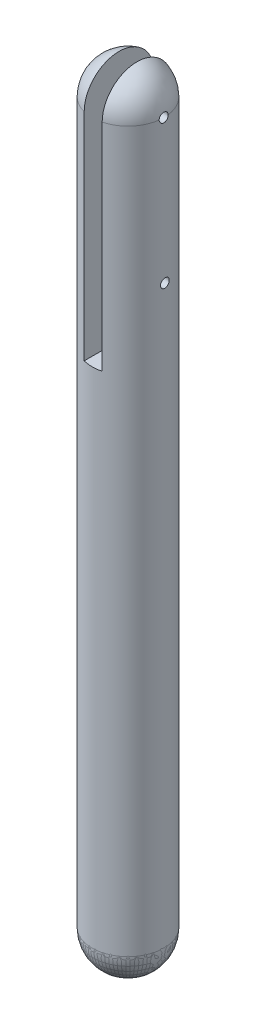
ISO-10303-21;
HEADER;
FILE_DESCRIPTION(('STEP AP214'),'2;1');
FILE_NAME('part.step','',(''),(''),'','','');
FILE_SCHEMA(('AUTOMOTIVE_DESIGN { 1 0 10303 214 1 1 1 1 }'));
ENDSEC;
DATA;
#1=APPLICATION_CONTEXT('core data for automotive mechanical design processes');
#2=APPLICATION_PROTOCOL_DEFINITION('international standard','automotive_design',2000,#1);
#3=PRODUCT_CONTEXT('',#1,'mechanical');
#4=PRODUCT('Part','Part','',(#3));
#5=PRODUCT_RELATED_PRODUCT_CATEGORY('part','',(#4));
#6=PRODUCT_DEFINITION_FORMATION('','',#4);
#7=PRODUCT_DEFINITION_CONTEXT('part definition',#1,'design');
#8=PRODUCT_DEFINITION('design','',#6,#7);
#9=PRODUCT_DEFINITION_SHAPE('','',#8);
#10=(LENGTH_UNIT() NAMED_UNIT(*) SI_UNIT(.MILLI.,.METRE.));
#11=(NAMED_UNIT(*) PLANE_ANGLE_UNIT() SI_UNIT($,.RADIAN.));
#12=(NAMED_UNIT(*) SI_UNIT($,.STERADIAN.) SOLID_ANGLE_UNIT());
#13=UNCERTAINTY_MEASURE_WITH_UNIT(LENGTH_MEASURE(1.E-05),#10,'distance_accuracy_value','');
#14=(GEOMETRIC_REPRESENTATION_CONTEXT(3) GLOBAL_UNCERTAINTY_ASSIGNED_CONTEXT((#13)) GLOBAL_UNIT_ASSIGNED_CONTEXT((#10,
#11,#12)) REPRESENTATION_CONTEXT('',''));
#15=CARTESIAN_POINT('',(0.,0.,0.));
#16=DIRECTION('',(0.,0.,1.));
#17=DIRECTION('',(1.,0.,0.));
#18=AXIS2_PLACEMENT_3D('',#15,#16,#17);
#19=CARTESIAN_POINT('',(0.,-100.,0.));
#20=DIRECTION('',(0.,1.,0.));
#21=DIRECTION('',(1.,0.,0.));
#22=AXIS2_PLACEMENT_3D('',#19,#20,#21);
#23=SPHERICAL_SURFACE('',#22,9.99999999999999);
#24=CARTESIAN_POINT('',(0.,-90.,0.));
#25=VERTEX_POINT('',#24);
#26=VERTEX_LOOP('',#25);
#27=FACE_BOUND('',#26,.T.);
#28=ADVANCED_FACE('F42',(#27),#23,.T.);
#29=CLOSED_SHELL('',(#28));
#30=MANIFOLD_SOLID_BREP('B2',#29);
#31=CARTESIAN_POINT('',(0.,100.,0.));
#32=DIRECTION('',(0.,-1.,0.));
#33=DIRECTION('',(1.,0.,0.));
#34=AXIS2_PLACEMENT_3D('',#31,#32,#33);
#35=SPHERICAL_SURFACE('',#34,10.);
#36=CARTESIAN_POINT('',(9.92156741649222,100.,0.));
#37=DIRECTION('',(-1.,0.,0.));
#38=DIRECTION('',(0.,0.,1.));
#39=AXIS2_PLACEMENT_3D('',#36,#37,#38);
#40=CIRCLE('',#39,1.25);
#41=CARTESIAN_POINT('',(9.92156741649231,100.,-1.25));
#42=VERTEX_POINT('',#41);
#43=CARTESIAN_POINT('',(9.9215674164922,100.,1.25));
#44=VERTEX_POINT('',#43);
#45=EDGE_CURVE('E145',#42,#44,#40,.F.);
#46=ORIENTED_EDGE('',*,*,#45,.F.);
#47=CARTESIAN_POINT('',(0.,100.,0.));
#48=DIRECTION('',(0.,-1.,0.));
#49=DIRECTION('',(1.,0.,0.));
#50=AXIS2_PLACEMENT_3D('',#47,#48,#49);
#51=CIRCLE('',#50,10.);
#52=CARTESIAN_POINT('',(2.5,100.,-9.68245836551853));
#53=VERTEX_POINT('',#52);
#54=EDGE_CURVE('E125',#53,#42,#51,.T.);
#55=ORIENTED_EDGE('',*,*,#54,.F.);
#56=CARTESIAN_POINT('',(2.5,100.,0.));
#57=DIRECTION('',(1.,0.,0.));
#58=DIRECTION('',(0.,1.,0.));
#59=AXIS2_PLACEMENT_3D('',#56,#57,#58);
#60=CIRCLE('',#59,9.68245836551854);
#61=CARTESIAN_POINT('',(2.5,100.,9.68245836551854));
#62=VERTEX_POINT('',#61);
#63=EDGE_CURVE('E132',#62,#53,#60,.F.);
#64=ORIENTED_EDGE('',*,*,#63,.F.);
#65=EDGE_CURVE('E126',#44,#62,#51,.T.);
#66=ORIENTED_EDGE('',*,*,#65,.F.);
#67=EDGE_LOOP('',(#46,#55,#64,#66));
#68=FACE_BOUND('',#67,.T.);
#69=ADVANCED_FACE('F54',(#68),#35,.T.);
#70=CARTESIAN_POINT('',(-9.92156741649221,100.,0.));
#71=DIRECTION('',(1.,0.,0.));
#72=DIRECTION('',(0.,0.,-1.));
#73=AXIS2_PLACEMENT_3D('',#70,#71,#72);
#74=CIRCLE('',#73,1.25);
#75=CARTESIAN_POINT('',(-9.9215674164922,100.,1.25));
#76=VERTEX_POINT('',#75);
#77=CARTESIAN_POINT('',(-9.92156741649221,100.,-1.25));
#78=VERTEX_POINT('',#77);
#79=EDGE_CURVE('E111',#76,#78,#74,.F.);
#80=ORIENTED_EDGE('',*,*,#79,.F.);
#81=CARTESIAN_POINT('',(-2.5,100.,9.68245836551854));
#82=VERTEX_POINT('',#81);
#83=EDGE_CURVE('E117',#82,#76,#51,.T.);
#84=ORIENTED_EDGE('',*,*,#83,.F.);
#85=CARTESIAN_POINT('',(-2.5,100.,0.));
#86=DIRECTION('',(-1.,0.,0.));
#87=DIRECTION('',(0.,-1.,0.));
#88=AXIS2_PLACEMENT_3D('',#85,#86,#87);
#89=CIRCLE('',#88,9.68245836551854);
#90=CARTESIAN_POINT('',(-2.5,100.,-9.68245836551854));
#91=VERTEX_POINT('',#90);
#92=EDGE_CURVE('E78',#91,#82,#89,.F.);
#93=ORIENTED_EDGE('',*,*,#92,.F.);
#94=EDGE_CURVE('E118',#78,#91,#51,.T.);
#95=ORIENTED_EDGE('',*,*,#94,.F.);
#96=EDGE_LOOP('',(#80,#84,#93,#95));
#97=FACE_BOUND('',#96,.T.);
#98=ADVANCED_FACE('F56',(#97),#35,.T.);
#99=CARTESIAN_POINT('',(0.,-100.,0.));
#100=DIRECTION('',(0.,-1.,0.));
#101=DIRECTION('',(-1.,0.,0.));
#102=AXIS2_PLACEMENT_3D('',#99,#100,#101);
#103=SPHERICAL_SURFACE('',#102,10.);
#104=CARTESIAN_POINT('',(0.,-100.,0.));
#105=DIRECTION('',(0.,-1.,0.));
#106=DIRECTION('',(1.,0.,0.));
#107=AXIS2_PLACEMENT_3D('',#104,#105,#106);
#108=CIRCLE('',#107,9.99999999999997);
#109=CARTESIAN_POINT('',(10.,-100.,0.));
#110=VERTEX_POINT('',#109);
#111=EDGE_CURVE('E123',#110,#110,#108,.T.);
#112=ORIENTED_EDGE('',*,*,#111,.T.);
#113=EDGE_LOOP('',(#112));
#114=FACE_BOUND('',#113,.T.);
#115=ADVANCED_FACE('F205',(#114),#103,.T.);
#116=CARTESIAN_POINT('',(0.,100.,0.));
#117=DIRECTION('',(0.,-1.,0.));
#118=DIRECTION('',(1.,0.,0.));
#119=AXIS2_PLACEMENT_3D('',#116,#117,#118);
#120=CYLINDRICAL_SURFACE('',#119,9.99999999999999);
#121=CARTESIAN_POINT('',(10.,61.2102547669151,0.));
#122=CARTESIAN_POINT('',(9.99999922075273,61.1924558536573,0.0677551433919592));
#123=CARTESIAN_POINT('',(9.99930470937657,61.1689364383772,0.134053462173073));
#124=CARTESIAN_POINT('',(9.99677732255985,61.1111182809687,0.261804354690536));
#125=CARTESIAN_POINT('',(9.9949432174497,61.0768079147245,0.323251613099448));
#126=CARTESIAN_POINT('',(9.99050752407033,60.9984201409211,0.439479437835096));
#127=CARTESIAN_POINT('',(9.987906432803,60.9543490628263,0.494264288987005));
#128=CARTESIAN_POINT('',(9.98237276596149,60.8576819870995,0.595666314860065));
#129=CARTESIAN_POINT('',(9.97944025547366,60.8050876624429,0.642285088720733));
#130=CARTESIAN_POINT('',(9.97368437247386,60.692631163987,0.726224189307111));
#131=CARTESIAN_POINT('',(9.97086143750259,60.6327431569669,0.763509946857733));
#132=CARTESIAN_POINT('',(9.96575502933599,60.5075357179316,0.827503523454673));
#133=CARTESIAN_POINT('',(9.96347156830909,60.4422161634466,0.854211103907363));
#134=CARTESIAN_POINT('',(9.95977686713034,60.3080341992004,0.896266481148849));
#135=CARTESIAN_POINT('',(9.95836511841395,60.2391738806042,0.911620902503819));
#136=CARTESIAN_POINT('',(9.95661462297802,60.0998399751531,0.93054681738624));
#137=CARTESIAN_POINT('',(9.9562758466591,60.0293664328551,0.934118635952604));
#138=CARTESIAN_POINT('',(9.95671878503276,59.8891015188251,0.929384732355681));
#139=CARTESIAN_POINT('',(9.95749610303527,59.8193085548041,0.921125616723659));
#140=CARTESIAN_POINT('',(9.96005268677378,59.6821056287523,0.893054697898082));
#141=CARTESIAN_POINT('',(9.96183195702334,59.6146956774577,0.873242842662259));
#142=CARTESIAN_POINT('',(9.96613900380381,59.4841332175519,0.822626663283878));
#143=CARTESIAN_POINT('',(9.96866708274455,59.4209824417027,0.791817896955211));
#144=CARTESIAN_POINT('',(9.97410498540843,59.30073322118,0.720082312091906));
#145=CARTESIAN_POINT('',(9.97701482085045,59.2436349623996,0.679155182916886));
#146=CARTESIAN_POINT('',(9.98279346229595,59.1368711059594,0.588146394071747));
#147=CARTESIAN_POINT('',(9.9856620587041,59.0872360199614,0.538028919452478));
#148=CARTESIAN_POINT('',(9.99088967690328,58.9970738900058,0.430155338495266));
#149=CARTESIAN_POINT('',(9.99324870026724,58.9565468179339,0.372399255736791));
#150=CARTESIAN_POINT('',(9.99703655860595,58.8857687413296,0.250894633552639));
#151=CARTESIAN_POINT('',(9.99846567814853,58.8555145944479,0.187147934207277));
#152=CARTESIAN_POINT('',(10.0000627426896,58.8061411454981,0.0554649310324432));
#153=CARTESIAN_POINT('',(10.0002307405236,58.7870213769787,-0.0124711971578524));
#154=CARTESIAN_POINT('',(9.99910773668996,58.7605405665586,-0.150196066167287));
#155=CARTESIAN_POINT('',(9.99782478542431,58.7531151844628,-0.219972507230552));
#156=CARTESIAN_POINT('',(9.99377175439099,58.7500189090679,-0.359741033460417));
#157=CARTESIAN_POINT('',(9.99100169620658,58.754347845175,-0.429733115482634));
#158=CARTESIAN_POINT('',(9.98410483226082,58.7745899642022,-0.56782349131972));
#159=CARTESIAN_POINT('',(9.97998042742901,58.7904827074674,-0.635924906786446));
#160=CARTESIAN_POINT('',(9.97065068566941,58.8333487279624,-0.768467556171692));
#161=CARTESIAN_POINT('',(9.96544530103787,58.8603224942502,-0.832908628398988));
#162=CARTESIAN_POINT('',(9.95431883193546,58.9247946745676,-0.956783278349281));
#163=CARTESIAN_POINT('',(9.94839313541342,58.9623631882799,-1.01617995313072));
#164=CARTESIAN_POINT('',(9.93635383155002,59.0468943973692,-1.12784384855809));
#165=CARTESIAN_POINT('',(9.93024021450393,59.0938575786043,-1.18011070024022));
#166=CARTESIAN_POINT('',(9.91832464994712,59.1962435166766,-1.27640573764652));
#167=CARTESIAN_POINT('',(9.91252515102247,59.2517225466252,-1.32037442987823));
#168=CARTESIAN_POINT('',(9.90182453334159,59.3693588128581,-1.39836546022831));
#169=CARTESIAN_POINT('',(9.89692339515101,59.4315159046288,-1.43238801352219));
#170=CARTESIAN_POINT('',(9.88850781109233,59.5605170704513,-1.48937719945058));
#171=CARTESIAN_POINT('',(9.88498822522109,59.6273426605278,-1.51238488398757));
#172=CARTESIAN_POINT('',(9.87965652739746,59.7639757780963,-1.54683361304348));
#173=CARTESIAN_POINT('',(9.87784428262701,59.8337830731929,-1.55827555729346));
#174=CARTESIAN_POINT('',(9.87611811233728,59.9735768325705,-1.56917862988323));
#175=CARTESIAN_POINT('',(9.87618356076308,60.0435529126623,-1.56876993441279));
#176=CARTESIAN_POINT('',(9.8781551998152,60.1824317883645,-1.55630608763255));
#177=CARTESIAN_POINT('',(9.88006134856942,60.2513346083531,-1.54425120124932));
#178=CARTESIAN_POINT('',(9.88551735138862,60.3858639031359,-1.50892725489708));
#179=CARTESIAN_POINT('',(9.88906124584775,60.4515013092451,-1.48569884193559));
#180=CARTESIAN_POINT('',(9.89745217365548,60.577952173617,-1.42872849537736));
#181=CARTESIAN_POINT('',(9.90229927590058,60.6387653766189,-1.39498600591939));
#182=CARTESIAN_POINT('',(9.91289245286158,60.7544177076356,-1.31760994177696));
#183=CARTESIAN_POINT('',(9.91864595709096,60.8092004711122,-1.27389315035587));
#184=CARTESIAN_POINT('',(9.93049571971525,60.9106887200176,-1.17795812933603));
#185=CARTESIAN_POINT('',(9.93659198757999,60.9573939821368,-1.12573966477849));
#186=CARTESIAN_POINT('',(9.94864687977604,61.0418393522429,-1.01371712443555));
#187=CARTESIAN_POINT('',(9.95460372678661,61.0794932239153,-0.95384781315584));
#188=CARTESIAN_POINT('',(9.9658138649689,61.1442110600969,-0.828555891961568));
#189=CARTESIAN_POINT('',(9.97106701335507,61.1712728775361,-0.763132159401287));
#190=CARTESIAN_POINT('',(9.98044627661644,61.2139721014867,-0.628671507919739));
#191=CARTESIAN_POINT('',(9.98457375176482,61.2296233352757,-0.559639071139293));
#192=CARTESIAN_POINT('',(9.99142411120762,61.2490529654595,-0.419906440105568));
#193=CARTESIAN_POINT('',(9.99414854761239,61.2528445053011,-0.349208179638563));
#194=CARTESIAN_POINT('',(9.99742666756125,61.2491986173023,-0.231703018357655));
#195=CARTESIAN_POINT('',(9.99840109004013,61.2450797089174,-0.184779190224219));
#196=CARTESIAN_POINT('',(9.99968801494348,61.2315858423277,-0.09168445890261));
#197=CARTESIAN_POINT('',(10.0000005234482,61.2222109324049,-0.045513548802091));
#198=CARTESIAN_POINT('',(10.,61.2102547669151,0.));
#199=B_SPLINE_CURVE_WITH_KNOTS('',3,(#121,#122,#123,#124,#125,#126,#127,#128,#129,#130,#131,
#132,#133,#134,#135,#136,#137,#138,#139,#140,#141,#142,#143,#144,#145,#146,#147,#148,#149,#150,
#151,#152,#153,#154,#155,#156,#157,#158,#159,#160,#161,#162,#163,#164,#165,#166,#167,#168,#169,
#170,#171,#172,#173,#174,#175,#176,#177,#178,#179,#180,#181,#182,#183,#184,#185,#186,#187,#188,
#189,#190,#191,#192,#193,#194,#195,#196,#197,#198),.UNSPECIFIED.,.T.,.F.,(4,2,2,2,2,2,2,2,2,2,2,
2,2,2,2,2,2,2,2,2,2,2,2,2,2,2,2,2,2,2,2,2,2,2,2,2,2,2,4),(0.,0.209989823831639,
0.420206629970538,0.630287515263106,0.840327214913993,1.05113375045477,1.26194504052291,
1.4726332249614,1.68331559723492,1.89317029070897,2.10302592953439,2.31296643535097,
2.52291338727946,2.73369659915287,2.94447916037895,3.15519718785395,3.36590638710589,
3.57545220497165,3.78499498165666,3.99416827711394,4.20335080537355,4.41395123107877,
4.62456255109085,4.83663080916037,5.04869447898988,5.25996152302954,5.47121213075379,
5.68014309376542,5.88906930414514,6.09724116629566,6.30542403600417,6.51541179333146,
6.72540535502741,6.93732666264459,7.14929090570485,7.36099786287222,7.57247011358041,
7.71352907103438,7.8545867327327),.UNSPECIFIED.);
#200=CARTESIAN_POINT('',(10.,61.2102547669151,0.));
#201=VERTEX_POINT('',#200);
#202=EDGE_CURVE('E174',#201,#201,#199,.T.);
#203=ORIENTED_EDGE('',*,*,#202,.F.);
#204=EDGE_LOOP('',(#203));
#205=FACE_BOUND('',#204,.T.);
#206=CARTESIAN_POINT('',(-9.99495709397346,58.7512604284789,-0.317541634481472));
#207=CARTESIAN_POINT('',(-9.99717287889749,58.7512633487862,-0.247767395474852));
#208=CARTESIAN_POINT('',(-9.99865362302269,58.7571220615867,-0.177927189512773));
#209=CARTESIAN_POINT('',(-10.0001574899652,58.7804243288944,-0.0401418186757699));
#210=CARTESIAN_POINT('',(-10.0001791558703,58.797879445033,0.0278013843683372));
#211=CARTESIAN_POINT('',(-9.99894118973362,58.8438727033208,0.15977633872146));
#212=CARTESIAN_POINT('',(-9.99768226472156,58.8724047244025,0.223810227729985));
#213=CARTESIAN_POINT('',(-9.99419369002461,58.9397318794147,0.346186095450651));
#214=CARTESIAN_POINT('',(-9.99196420427216,58.9785252797142,0.404529033356001));
#215=CARTESIAN_POINT('',(-9.98692800158285,59.065424635624,0.51409291976997));
#216=CARTESIAN_POINT('',(-9.98411942521477,59.1135605596456,0.565290012525996));
#217=CARTESIAN_POINT('',(-9.97837869574651,59.2177149643716,0.658911268321315));
#218=CARTESIAN_POINT('',(-9.97544653615009,59.273733859813,0.701334969487003));
#219=CARTESIAN_POINT('',(-9.96988747006123,59.3923478828821,0.776383357323358));
#220=CARTESIAN_POINT('',(-9.9672619403448,59.4549704363211,0.808964817163741));
#221=CARTESIAN_POINT('',(-9.96271644875294,59.5848219940823,0.863148042665063));
#222=CARTESIAN_POINT('',(-9.96079647482045,59.6520509196641,0.88474999595434));
#223=CARTESIAN_POINT('',(-9.95794237535219,59.7890685471896,0.916317079143828));
#224=CARTESIAN_POINT('',(-9.95700631144884,59.8588519347881,0.926305093411254));
#225=CARTESIAN_POINT('',(-9.95624730936342,59.9991102813461,0.934428698103834));
#226=CARTESIAN_POINT('',(-9.95642434391306,60.0695852233219,0.93256457887833));
#227=CARTESIAN_POINT('',(-9.95786359221615,60.2089673061129,0.917066738184375));
#228=CARTESIAN_POINT('',(-9.95912202489442,60.2778790518826,0.903474024702912));
#229=CARTESIAN_POINT('',(-9.96253987441317,60.4124398764064,0.864967994963325));
#230=CARTESIAN_POINT('',(-9.96469930593008,60.4780889019943,0.840054494299505));
#231=CARTESIAN_POINT('',(-9.96961355122974,60.6043905013737,0.779566109297345));
#232=CARTESIAN_POINT('',(-9.97236938389035,60.6650342763148,0.743972939339697));
#233=CARTESIAN_POINT('',(-9.97806973990332,60.7795050641537,0.663144245430128));
#234=CARTESIAN_POINT('',(-9.98101426831679,60.8333318940959,0.617908462773772));
#235=CARTESIAN_POINT('',(-9.98665264655754,60.9328460394902,0.518875582912959));
#236=CARTESIAN_POINT('',(-9.98934553607501,60.9785027372537,0.465047655018655));
#237=CARTESIAN_POINT('',(-9.99402103489487,61.0601350546612,0.350464756139953));
#238=CARTESIAN_POINT('',(-9.99600365456773,61.0961108156522,0.289709886311047));
#239=CARTESIAN_POINT('',(-9.99886943673621,61.1572891016005,0.163114687402185));
#240=CARTESIAN_POINT('',(-9.99975466689505,61.1825118280125,0.0972841711474343));
#241=CARTESIAN_POINT('',(-10.0001565138171,61.221551888979,-0.0376790988695813));
#242=CARTESIAN_POINT('',(-9.99967318846615,61.2353697058949,-0.106811712841489));
#243=CARTESIAN_POINT('',(-9.99721471210096,61.2511643550903,-0.245997658539455));
#244=CARTESIAN_POINT('',(-9.99524790637855,61.2532068755335,-0.316043693500364));
#245=CARTESIAN_POINT('',(-9.9898669180148,61.2455902507894,-0.455438941324031));
#246=CARTESIAN_POINT('',(-9.9864527363144,61.2359311132092,-0.52478815463976));
#247=CARTESIAN_POINT('',(-9.97837272223098,61.2052135900858,-0.660852773880742));
#248=CARTESIAN_POINT('',(-9.97370659339222,61.1841525034058,-0.727567551684904));
#249=CARTESIAN_POINT('',(-9.96346281401032,61.1312508037894,-0.856501898133302));
#250=CARTESIAN_POINT('',(-9.9578851153873,61.0994096221721,-0.918721229419723));
#251=CARTESIAN_POINT('',(-9.94622114752026,61.025553654603,-1.03743678326597));
#252=CARTESIAN_POINT('',(-9.94013119225205,60.9834601065548,-1.09388364801717));
#253=CARTESIAN_POINT('',(-9.92800917661058,60.8904044384073,-1.19893084204104));
#254=CARTESIAN_POINT('',(-9.92197711863616,60.8394419525025,-1.24753084750517));
#255=CARTESIAN_POINT('',(-9.91048716805416,60.7297667698372,-1.33575396564824));
#256=CARTESIAN_POINT('',(-9.90503236963665,60.671015769592,-1.37532989719711));
#257=CARTESIAN_POINT('',(-9.89524973562431,60.5476078451794,-1.44403679716896));
#258=CARTESIAN_POINT('',(-9.89092185165092,60.4829511747041,-1.4731682139963));
#259=CARTESIAN_POINT('',(-9.88383882456319,60.349994632242,-1.51996395336557));
#260=CARTESIAN_POINT('',(-9.88107383384211,60.2817206053207,-1.53770017476637));
#261=CARTESIAN_POINT('',(-9.87734815484016,60.1431170131683,-1.56145463395445));
#262=CARTESIAN_POINT('',(-9.87638733731256,60.0727875955472,-1.56747371113151));
#263=CARTESIAN_POINT('',(-9.87636600297864,59.9328641074518,-1.5676077059488));
#264=CARTESIAN_POINT('',(-9.8772854972404,59.8632701259443,-1.56184784134773));
#265=CARTESIAN_POINT('',(-9.88089398808741,59.7260536906387,-1.53885263347401));
#266=CARTESIAN_POINT('',(-9.88358297830333,59.658431229745,-1.52161733150735));
#267=CARTESIAN_POINT('',(-9.89046782184958,59.5270933844687,-1.47620103479308));
#268=CARTESIAN_POINT('',(-9.89466288201797,59.4633759641614,-1.44802580085392));
#269=CARTESIAN_POINT('',(-9.90416327368289,59.3415576485137,-1.38154711091149));
#270=CARTESIAN_POINT('',(-9.90946863794486,59.2834569189978,-1.34324335600345));
#271=CARTESIAN_POINT('',(-9.92076020261455,59.1738866280787,-1.25714588714202));
#272=CARTESIAN_POINT('',(-9.92675273563435,59.1224899325125,-1.2092602719695));
#273=CARTESIAN_POINT('',(-9.93883531666244,59.0284180549444,-1.10556398346566));
#274=CARTESIAN_POINT('',(-9.94492538954936,58.9857451375068,-1.04975125872956));
#275=CARTESIAN_POINT('',(-9.95671989664367,58.9100237659077,-0.931287627779475));
#276=CARTESIAN_POINT('',(-9.96242096922605,58.8770526173559,-0.868586989093764));
#277=CARTESIAN_POINT('',(-9.9729061097469,58.8221651036082,-0.738501773935106));
#278=CARTESIAN_POINT('',(-9.97769115456389,58.8002369207046,-0.671122292834242));
#279=CARTESIAN_POINT('',(-9.98465401341589,58.7732351855972,-0.555766471249513));
#280=CARTESIAN_POINT('',(-9.98717529877996,58.7650084808757,-0.50852466554338));
#281=CARTESIAN_POINT('',(-9.99156572070655,58.7540201216818,-0.41337949236445));
#282=CARTESIAN_POINT('',(-9.99343486263462,58.7512584222448,-0.365476130338039));
#283=CARTESIAN_POINT('',(-9.99495709397346,58.7512604284789,-0.317541634481472));
#284=B_SPLINE_CURVE_WITH_KNOTS('',3,(#206,#207,#208,#209,#210,#211,#212,#213,#214,#215,#216,
#217,#218,#219,#220,#221,#222,#223,#224,#225,#226,#227,#228,#229,#230,#231,#232,#233,#234,#235,
#236,#237,#238,#239,#240,#241,#242,#243,#244,#245,#246,#247,#248,#249,#250,#251,#252,#253,#254,
#255,#256,#257,#258,#259,#260,#261,#262,#263,#264,#265,#266,#267,#268,#269,#270,#271,#272,#273,
#274,#275,#276,#277,#278,#279,#280,#281,#282,#283),.UNSPECIFIED.,.T.,.F.,(4,2,2,2,2,2,2,2,2,2,2,
2,2,2,2,2,2,2,2,2,2,2,2,2,2,2,2,2,2,2,2,2,2,2,2,2,2,2,4),(0.,0.209253835233692,
0.418716610570876,0.628063801727444,0.837375646834032,1.04737035134186,1.25737610817002,
1.46829122503748,1.67920273746397,1.88969795705682,2.1001880200327,2.30994509174696,
2.51970558034244,2.72982728824575,2.93995463427461,3.15085365686321,3.36174960004637,
3.57224757347624,3.78273664361053,3.99205036151581,4.20136394334722,4.41072713355439,
4.62010136999004,4.8311378442685,5.04218302495455,5.25430754114165,5.4664229492986,
5.67718650307561,5.88793495767108,6.09645466882146,6.30497362940631,6.51338293554014,
6.72179839276803,6.9323178896562,7.14289196510622,7.35510112121707,7.56708269503099,
7.7108400440191,7.85459621020285),.UNSPECIFIED.);
#285=CARTESIAN_POINT('',(-9.99495709397346,58.7512604284789,-0.317541634481472));
#286=VERTEX_POINT('',#285);
#287=EDGE_CURVE('E179',#286,#286,#284,.T.);
#288=ORIENTED_EDGE('',*,*,#287,.F.);
#289=EDGE_LOOP('',(#288));
#290=FACE_BOUND('',#289,.T.);
#291=CARTESIAN_POINT('',(9.99999999999999,101.25,0.));
#292=CARTESIAN_POINT('',(9.99999902448213,101.249997029532,0.0699205477778808));
#293=CARTESIAN_POINT('',(9.9992589227745,101.244113560415,0.139884787151374));
#294=CARTESIAN_POINT('',(9.99637770055679,101.220736122715,0.277866401044876));
#295=CARTESIAN_POINT('',(9.99423511720714,101.203230031038,0.345881665311872));
#296=CARTESIAN_POINT('',(9.98879030522202,101.157131178043,0.477947787406526));
#297=CARTESIAN_POINT('',(9.9854888572777,101.128545879095,0.542001280073068));
#298=CARTESIAN_POINT('',(9.97809350439048,101.061116358015,0.664389737446517));
#299=CARTESIAN_POINT('',(9.97399973542057,101.022273895735,0.722725680778184));
#300=CARTESIAN_POINT('',(9.96545160653162,100.93520402508,0.832356408465657));
#301=CARTESIAN_POINT('',(9.96099557346207,100.886931435327,0.883615182468561));
#302=CARTESIAN_POINT('',(9.95223863004874,100.782468588232,0.977326396778747));
#303=CARTESIAN_POINT('',(9.94793772762133,100.726277927543,1.01977838819613));
#304=CARTESIAN_POINT('',(9.93996152809791,100.607340011217,1.09480508064197));
#305=CARTESIAN_POINT('',(9.93628838588954,100.544571319216,1.12734604797054));
#306=CARTESIAN_POINT('',(9.9300056422884,100.414406474026,1.18141153828756));
#307=CARTESIAN_POINT('',(9.92739600056567,100.347010496426,1.20293647903261));
#308=CARTESIAN_POINT('',(9.92355169801806,100.209877902207,1.23424949001238));
#309=CARTESIAN_POINT('',(9.92230991718371,100.140155371148,1.24409835736585));
#310=CARTESIAN_POINT('',(9.92132014071395,100.000036868264,1.25196777477861));
#311=CARTESIAN_POINT('',(9.92157208500753,99.9296409236344,1.24998880050121));
#312=CARTESIAN_POINT('',(9.92353477684875,99.7905975863756,1.23430861822395));
#313=CARTESIAN_POINT('',(9.92523718980163,99.7219425068999,1.22067438149235));
#314=CARTESIAN_POINT('',(9.92989599878813,99.5879024893905,1.18217519159102));
#315=CARTESIAN_POINT('',(9.93285242022861,99.522517617643,1.15731001087595));
#316=CARTESIAN_POINT('',(9.93969557932325,99.3966660004891,1.09698277995582));
#317=CARTESIAN_POINT('',(9.94358486605721,99.3362133498755,1.06149162685381));
#318=CARTESIAN_POINT('',(9.95185355715298,99.2220966527934,0.980940734728455));
#319=CARTESIAN_POINT('',(9.9562329839283,99.1684329170132,0.935880558040385));
#320=CARTESIAN_POINT('',(9.96502554945211,99.0690286446386,0.83709955537689));
#321=CARTESIAN_POINT('',(9.96943871193444,99.023345454117,0.783321003920008));
#322=CARTESIAN_POINT('',(9.97777316277925,98.9416455599847,0.668828584556961));
#323=CARTESIAN_POINT('',(9.98169445000752,98.905628878664,0.60811470065912));
#324=CARTESIAN_POINT('',(9.98860576109289,98.8442843397681,0.481430835681732));
#325=CARTESIAN_POINT('',(9.99159547200767,98.8189600730594,0.415459097668852));
#326=CARTESIAN_POINT('',(9.99630392890029,98.7797647532384,0.280153970215525));
#327=CARTESIAN_POINT('',(9.99802273437934,98.7658931639315,0.210820738315332));
#328=CARTESIAN_POINT('',(9.99998798205379,98.7500712878697,0.0712565819567482));
#329=CARTESIAN_POINT('',(10.0002441807132,98.748042003818,0.00103474509930298));
#330=CARTESIAN_POINT('',(9.99928169002714,98.755753867028,-0.138748018248749));
#331=CARTESIAN_POINT('',(9.99806303209105,98.7654947636258,-0.208308958782354));
#332=CARTESIAN_POINT('',(9.99429384378345,98.7964048543872,-0.344562253860761));
#333=CARTESIAN_POINT('',(9.99174770406933,98.8175363817013,-0.411263285212353));
#334=CARTESIAN_POINT('',(9.98560861550098,98.8705887259565,-0.540174827429202));
#335=CARTESIAN_POINT('',(9.98201563110311,98.9025099092457,-0.602385185732654));
#336=CARTESIAN_POINT('',(9.97415911455055,98.9764265687537,-0.720902260343713));
#337=CARTESIAN_POINT('',(9.96989222021253,99.0184731449028,-0.777176879971912));
#338=CARTESIAN_POINT('',(9.96117571162827,99.1113747487671,-0.881898494813161));
#339=CARTESIAN_POINT('',(9.95672609013448,99.1622301261255,-0.930345179168427));
#340=CARTESIAN_POINT('',(9.94811552731291,99.2716537083786,-1.018315979409));
#341=CARTESIAN_POINT('',(9.94395637360662,99.3302641731552,-1.05778773028397));
#342=CARTESIAN_POINT('',(9.93642705518573,99.4533291224273,-1.12632644472175));
#343=CARTESIAN_POINT('',(9.93305687465512,99.5177834897383,-1.15539361686418));
#344=CARTESIAN_POINT('',(9.92749925196497,99.6505376595738,-1.20221328943327));
#345=CARTESIAN_POINT('',(9.92530872592393,99.718826915024,-1.21999531372855));
#346=CARTESIAN_POINT('',(9.92234957953726,99.8574512418903,-1.24383499693393));
#347=CARTESIAN_POINT('',(9.92158089304387,99.9277862179795,-1.24989320126788));
#348=CARTESIAN_POINT('',(9.92155438491227,100.067984464602,-1.25010326804242));
#349=CARTESIAN_POINT('',(9.92228612375976,100.137847624166,-1.24433739884964));
#350=CARTESIAN_POINT('',(9.92515557268599,100.275603564673,-1.22123720242466));
#351=CARTESIAN_POINT('',(9.92729328291539,100.343496345404,-1.20390287395288));
#352=CARTESIAN_POINT('',(9.93273057887274,100.475373478383,-1.15818353684483));
#353=CARTESIAN_POINT('',(9.93602974796391,100.539359222511,-1.12980249048547));
#354=CARTESIAN_POINT('',(9.94341891622408,100.661673327024,-1.06280345107516));
#355=CARTESIAN_POINT('',(9.94750892530205,100.72000161651,-1.0241853297548));
#356=CARTESIAN_POINT('',(9.95605302376116,100.82976561267,-0.937503165632929));
#357=CARTESIAN_POINT('',(9.96050936042015,100.881152730477,-0.889377812887488));
#358=CARTESIAN_POINT('',(9.96926415796449,100.975153412584,-0.785175113484197));
#359=CARTESIAN_POINT('',(9.97356258137794,101.017764905387,-0.729095894570786));
#360=CARTESIAN_POINT('',(9.98153528293372,101.093142678553,-0.610332810427104));
#361=CARTESIAN_POINT('',(9.9852071253915,101.12587090295,-0.547624639798083));
#362=CARTESIAN_POINT('',(9.99148824538362,101.180285621458,-0.417591451150639));
#363=CARTESIAN_POINT('',(9.99409867684787,101.201984113177,-0.350271540435117));
#364=CARTESIAN_POINT('',(9.99733360163872,101.228529669086,-0.235502885983961));
#365=CARTESIAN_POINT('',(9.99832862947726,101.236569470991,-0.18877783175846));
#366=CARTESIAN_POINT('',(9.99966215664593,101.247305622847,-0.0947085316062171));
#367=CARTESIAN_POINT('',(10.0000006608173,101.2500020122,-0.0473642902480134));
#368=CARTESIAN_POINT('',(9.99999999999999,101.25,0.));
#369=B_SPLINE_CURVE_WITH_KNOTS('',3,(#291,#292,#293,#294,#295,#296,#297,#298,#299,#300,#301,
#302,#303,#304,#305,#306,#307,#308,#309,#310,#311,#312,#313,#314,#315,#316,#317,#318,#319,#320,
#321,#322,#323,#324,#325,#326,#327,#328,#329,#330,#331,#332,#333,#334,#335,#336,#337,#338,#339,
#340,#341,#342,#343,#344,#345,#346,#347,#348,#349,#350,#351,#352,#353,#354,#355,#356,#357,#358,
#359,#360,#361,#362,#363,#364,#365,#366,#367,#368),.UNSPECIFIED.,.T.,.F.,(4,2,2,2,2,2,2,2,2,2,2,
2,2,2,2,2,2,2,2,2,2,2,2,2,2,2,2,2,2,2,2,2,2,2,2,2,2,2,4),(0.,0.209588636388123,
0.419396230471714,0.629062754090884,0.838693327955367,1.04935406600921,1.26002553900005,
1.47140625159435,1.68277894748403,1.89304612643161,2.10330484942333,2.31236348220847,
2.52142635083122,2.73106713142767,2.94071750256819,3.15181739068208,3.36291776556558,
3.57408897865803,3.7852503045189,3.99500139695961,4.20474802250964,4.41380526946698,
4.62286961539474,4.83301201464211,5.04316275687544,5.25450985753786,5.46585272110769,
5.67664037140463,5.88741821505313,6.09673450601107,6.30605081939773,6.51529212353244,
6.7245360495613,6.93517618845914,7.14586599235007,7.35735701518427,7.56861749342017,
7.71059421593814,7.85256989150218),.UNSPECIFIED.);
#370=EDGE_CURVE('E119',#44,#42,#369,.T.);
#371=ORIENTED_EDGE('',*,*,#370,.F.);
#372=ORIENTED_EDGE('',*,*,#65,.T.);
#373=DIRECTION('',(0.,-1.,0.));
#374=VECTOR('',#373,1.);
#375=CARTESIAN_POINT('',(2.5,100.,9.68245836551853));
#376=LINE('',#375,#374);
#377=CARTESIAN_POINT('',(2.50000000000001,40.,9.68245836551853));
#378=VERTEX_POINT('',#377);
#379=EDGE_CURVE('E215',#378,#62,#376,.F.);
#380=ORIENTED_EDGE('',*,*,#379,.F.);
#381=CARTESIAN_POINT('',(0.,40.,0.));
#382=DIRECTION('',(0.,-1.,0.));
#383=DIRECTION('',(0.,0.,-1.));
#384=AXIS2_PLACEMENT_3D('',#381,#382,#383);
#385=CIRCLE('',#384,9.99999999999999);
#386=CARTESIAN_POINT('',(-2.50000000000001,40.,9.68245836551853));
#387=VERTEX_POINT('',#386);
#388=EDGE_CURVE('E128',#387,#378,#385,.F.);
#389=ORIENTED_EDGE('',*,*,#388,.F.);
#390=DIRECTION('',(0.,-1.,0.));
#391=VECTOR('',#390,1.);
#392=CARTESIAN_POINT('',(-2.5,100.,9.68245836551853));
#393=LINE('',#392,#391);
#394=EDGE_CURVE('E63',#82,#387,#393,.T.);
#395=ORIENTED_EDGE('',*,*,#394,.F.);
#396=ORIENTED_EDGE('',*,*,#83,.T.);
#397=CARTESIAN_POINT('',(-9.99999999999998,98.75,0.));
#398=CARTESIAN_POINT('',(-9.99999902448213,98.7500029704679,0.0699205477778808));
#399=CARTESIAN_POINT('',(-9.99925892277449,98.7558864395846,0.139884787151374));
#400=CARTESIAN_POINT('',(-9.99637770055678,98.7792638772854,0.277866401044876));
#401=CARTESIAN_POINT('',(-9.99423511720713,98.7967699689617,0.345881665311871));
#402=CARTESIAN_POINT('',(-9.98879030522201,98.842868821957,0.477947787406528));
#403=CARTESIAN_POINT('',(-9.98548885727769,98.8714541209049,0.542001280073073));
#404=CARTESIAN_POINT('',(-9.97809350439047,98.9388836419849,0.664389737446522));
#405=CARTESIAN_POINT('',(-9.97399973542056,98.9777261042654,0.722725680778186));
#406=CARTESIAN_POINT('',(-9.96545160653161,99.0647959749198,0.832356408465654));
#407=CARTESIAN_POINT('',(-9.96099557346207,99.1130685646731,0.883615182468558));
#408=CARTESIAN_POINT('',(-9.95223863004874,99.2175314117683,0.977326396778745));
#409=CARTESIAN_POINT('',(-9.94793772762132,99.2737220724566,1.01977838819613));
#410=CARTESIAN_POINT('',(-9.93996152809791,99.3926599887828,1.09480508064197));
#411=CARTESIAN_POINT('',(-9.93628838588954,99.455428680784,1.12734604797054));
#412=CARTESIAN_POINT('',(-9.93000564228839,99.5855935259737,1.18141153828756));
#413=CARTESIAN_POINT('',(-9.92739600056566,99.6529895035735,1.20293647903261));
#414=CARTESIAN_POINT('',(-9.92355169801805,99.7901220977934,1.23424949001238));
#415=CARTESIAN_POINT('',(-9.92230991718371,99.8598446288521,1.24409835736585));
#416=CARTESIAN_POINT('',(-9.92132014071394,99.9999631317359,1.25196777477861));
#417=CARTESIAN_POINT('',(-9.92157208500752,100.070359076366,1.24998880050121));
#418=CARTESIAN_POINT('',(-9.92353477684874,100.209402413624,1.23430861822395));
#419=CARTESIAN_POINT('',(-9.92523718980163,100.2780574931,1.22067438149235));
#420=CARTESIAN_POINT('',(-9.92989599878813,100.412097510609,1.18217519159102));
#421=CARTESIAN_POINT('',(-9.9328524202286,100.477482382357,1.15731001087595));
#422=CARTESIAN_POINT('',(-9.93969557932324,100.603333999511,1.09698277995583));
#423=CARTESIAN_POINT('',(-9.9435848660572,100.663786650124,1.06149162685382));
#424=CARTESIAN_POINT('',(-9.95185355715297,100.777903347207,0.98094073472846));
#425=CARTESIAN_POINT('',(-9.95623298392829,100.831567082987,0.93588055804039));
#426=CARTESIAN_POINT('',(-9.96502554945211,100.930971355361,0.837099555376889));
#427=CARTESIAN_POINT('',(-9.96943871193443,100.976654545883,0.783321003920003));
#428=CARTESIAN_POINT('',(-9.97777316277925,101.058354440015,0.668828584556954));
#429=CARTESIAN_POINT('',(-9.98169445000751,101.094371121336,0.608114700659117));
#430=CARTESIAN_POINT('',(-9.98860576109288,101.155715660232,0.481430835681733));
#431=CARTESIAN_POINT('',(-9.99159547200767,101.181039926941,0.415459097668854));
#432=CARTESIAN_POINT('',(-9.99630392890029,101.220235246762,0.280153970215527));
#433=CARTESIAN_POINT('',(-9.99802273437933,101.234106836069,0.210820738315332));
#434=CARTESIAN_POINT('',(-9.99998798205378,101.24992871213,0.0712565819567464));
#435=CARTESIAN_POINT('',(-10.0002441807132,101.251957996182,0.00103474509930171));
#436=CARTESIAN_POINT('',(-9.99928169002713,101.244246132972,-0.138748018248749));
#437=CARTESIAN_POINT('',(-9.99806303209105,101.234505236374,-0.208308958782353));
#438=CARTESIAN_POINT('',(-9.99429384378344,101.203595145613,-0.34456225386076));
#439=CARTESIAN_POINT('',(-9.99174770406932,101.182463618299,-0.411263285212351));
#440=CARTESIAN_POINT('',(-9.98560861550097,101.129411274044,-0.540174827429202));
#441=CARTESIAN_POINT('',(-9.9820156311031,101.097490090754,-0.602385185732656));
#442=CARTESIAN_POINT('',(-9.97415911455054,101.023573431246,-0.720902260343712));
#443=CARTESIAN_POINT('',(-9.96989222021253,100.981526855097,-0.777176879971907));
#444=CARTESIAN_POINT('',(-9.96117571162826,100.888625251233,-0.881898494813155));
#445=CARTESIAN_POINT('',(-9.95672609013447,100.837769873875,-0.930345179168425));
#446=CARTESIAN_POINT('',(-9.9481155273129,100.728346291621,-1.018315979409));
#447=CARTESIAN_POINT('',(-9.94395637360662,100.669735826845,-1.05778773028396));
#448=CARTESIAN_POINT('',(-9.93642705518572,100.546670877573,-1.12632644472175));
#449=CARTESIAN_POINT('',(-9.93305687465512,100.482216510262,-1.15539361686418));
#450=CARTESIAN_POINT('',(-9.92749925196496,100.349462340426,-1.20221328943327));
#451=CARTESIAN_POINT('',(-9.92530872592393,100.281173084976,-1.21999531372855));
#452=CARTESIAN_POINT('',(-9.92234957953726,100.14254875811,-1.24383499693393));
#453=CARTESIAN_POINT('',(-9.92158089304387,100.07221378202,-1.24989320126788));
#454=CARTESIAN_POINT('',(-9.92155438491226,99.9320155353977,-1.25010326804242));
#455=CARTESIAN_POINT('',(-9.92228612375975,99.8621523758341,-1.24433739884964));
#456=CARTESIAN_POINT('',(-9.92515557268599,99.7243964353275,-1.22123720242466));
#457=CARTESIAN_POINT('',(-9.92729328291539,99.6565036545956,-1.20390287395288));
#458=CARTESIAN_POINT('',(-9.93273057887273,99.5246265216168,-1.15818353684483));
#459=CARTESIAN_POINT('',(-9.9360297479639,99.4606407774891,-1.12980249048547));
#460=CARTESIAN_POINT('',(-9.94341891622408,99.3383266729759,-1.06280345107516));
#461=CARTESIAN_POINT('',(-9.94750892530205,99.2799983834901,-1.0241853297548));
#462=CARTESIAN_POINT('',(-9.95605302376115,99.1702343873298,-0.937503165632923));
#463=CARTESIAN_POINT('',(-9.96050936042015,99.1188472695225,-0.889377812887484));
#464=CARTESIAN_POINT('',(-9.96926415796448,99.024846587416,-0.785175113484197));
#465=CARTESIAN_POINT('',(-9.97356258137793,98.9822350946128,-0.729095894570789));
#466=CARTESIAN_POINT('',(-9.98153528293371,98.9068573214474,-0.610332810427109));
#467=CARTESIAN_POINT('',(-9.98520712539149,98.8741290970504,-0.547624639798088));
#468=CARTESIAN_POINT('',(-9.99148824538361,98.8197143785419,-0.417591451150644));
#469=CARTESIAN_POINT('',(-9.99409867684786,98.7980158868233,-0.350271540435121));
#470=CARTESIAN_POINT('',(-9.99733360163871,98.7714703309144,-0.235502885983965));
#471=CARTESIAN_POINT('',(-9.99832862947725,98.763430529009,-0.188777831758462));
#472=CARTESIAN_POINT('',(-9.99966215664593,98.7526943771534,-0.0947085316062186));
#473=CARTESIAN_POINT('',(-10.0000006608173,98.7499979878003,-0.0473642902480142));
#474=CARTESIAN_POINT('',(-9.99999999999998,98.75,0.));
#475=B_SPLINE_CURVE_WITH_KNOTS('',3,(#397,#398,#399,#400,#401,#402,#403,#404,#405,#406,#407,
#408,#409,#410,#411,#412,#413,#414,#415,#416,#417,#418,#419,#420,#421,#422,#423,#424,#425,#426,
#427,#428,#429,#430,#431,#432,#433,#434,#435,#436,#437,#438,#439,#440,#441,#442,#443,#444,#445,
#446,#447,#448,#449,#450,#451,#452,#453,#454,#455,#456,#457,#458,#459,#460,#461,#462,#463,#464,
#465,#466,#467,#468,#469,#470,#471,#472,#473,#474),.UNSPECIFIED.,.T.,.F.,(4,2,2,2,2,2,2,2,2,2,2,
2,2,2,2,2,2,2,2,2,2,2,2,2,2,2,2,2,2,2,2,2,2,2,2,2,2,2,4),(0.,0.209588636388123,
0.419396230471714,0.62906275409089,0.838693327955368,1.0493540660092,1.26002553900005,
1.47140625159435,1.68277894748403,1.89304612643161,2.10330484942333,2.31236348220848,
2.52142635083121,2.73106713142766,2.94071750256819,3.15181739068209,3.36291776556558,
3.57408897865802,3.7852503045189,3.99500139695961,4.20474802250964,4.41380526946697,
4.62286961539474,4.8330120146421,5.04316275687543,5.25450985753785,5.46585272110769,
5.67664037140462,5.88741821505314,6.09673450601107,6.30605081939773,6.51529212353241,
6.72453604956132,6.93517618845914,7.14586599235006,7.35735701518426,7.56861749342016,
7.71059421593814,7.85256989150218),.UNSPECIFIED.);
#476=EDGE_CURVE('E71',#78,#76,#475,.T.);
#477=ORIENTED_EDGE('',*,*,#476,.F.);
#478=ORIENTED_EDGE('',*,*,#94,.T.);
#479=DIRECTION('',(0.,-1.,0.));
#480=VECTOR('',#479,1.);
#481=CARTESIAN_POINT('',(-2.5,100.,-9.68245836551853));
#482=LINE('',#481,#480);
#483=CARTESIAN_POINT('',(-2.50000000000001,40.,-9.68245836551853));
#484=VERTEX_POINT('',#483);
#485=EDGE_CURVE('E40',#484,#91,#482,.F.);
#486=ORIENTED_EDGE('',*,*,#485,.F.);
#487=CARTESIAN_POINT('',(2.50000000000001,40.,-9.68245836551853));
#488=VERTEX_POINT('',#487);
#489=EDGE_CURVE('E211',#488,#484,#385,.F.);
#490=ORIENTED_EDGE('',*,*,#489,.F.);
#491=DIRECTION('',(0.,-1.,0.));
#492=VECTOR('',#491,1.);
#493=CARTESIAN_POINT('',(2.5,100.,-9.68245836551853));
#494=LINE('',#493,#492);
#495=EDGE_CURVE('E209',#53,#488,#494,.T.);
#496=ORIENTED_EDGE('',*,*,#495,.F.);
#497=ORIENTED_EDGE('',*,*,#54,.T.);
#498=EDGE_LOOP('',(#371,#372,#380,#389,#395,#396,#477,#478,#486,#490,#496,#497));
#499=FACE_BOUND('',#498,.T.);
#500=ORIENTED_EDGE('',*,*,#111,.F.);
#501=EDGE_LOOP('',(#500));
#502=FACE_BOUND('',#501,.T.);
#503=ADVANCED_FACE('F121',(#205,#290,#499,#502),#120,.T.);
#504=CARTESIAN_POINT('',(2.5,110.,-10.));
#505=DIRECTION('',(1.,0.,0.));
#506=DIRECTION('',(0.,1.,0.));
#507=AXIS2_PLACEMENT_3D('',#504,#505,#506);
#508=PLANE('',#507);
#509=CARTESIAN_POINT('',(2.50000000000001,60.0012604284789,-0.317541634481472));
#510=DIRECTION('',(1.,0.,0.));
#511=DIRECTION('',(0.,1.,0.));
#512=AXIS2_PLACEMENT_3D('',#509,#510,#511);
#513=CIRCLE('',#512,1.25);
#514=CARTESIAN_POINT('',(2.50000000000001,61.2512604284789,-0.317541634481472));
#515=VERTEX_POINT('',#514);
#516=EDGE_CURVE('E184',#515,#515,#513,.T.);
#517=ORIENTED_EDGE('',*,*,#516,.T.);
#518=EDGE_LOOP('',(#517));
#519=FACE_BOUND('',#518,.T.);
#520=CARTESIAN_POINT('',(2.5,100.,0.));
#521=DIRECTION('',(1.,0.,0.));
#522=DIRECTION('',(0.,1.,0.));
#523=AXIS2_PLACEMENT_3D('',#520,#521,#522);
#524=CIRCLE('',#523,1.25);
#525=CARTESIAN_POINT('',(2.5,101.25,0.));
#526=VERTEX_POINT('',#525);
#527=EDGE_CURVE('E113',#526,#526,#524,.T.);
#528=ORIENTED_EDGE('',*,*,#527,.T.);
#529=EDGE_LOOP('',(#528));
#530=FACE_BOUND('',#529,.T.);
#531=ORIENTED_EDGE('',*,*,#379,.T.);
#532=ORIENTED_EDGE('',*,*,#63,.T.);
#533=ORIENTED_EDGE('',*,*,#495,.T.);
#534=DIRECTION('',(0.,0.,1.));
#535=VECTOR('',#534,1.);
#536=CARTESIAN_POINT('',(2.50000000000001,40.,-10.));
#537=LINE('',#536,#535);
#538=EDGE_CURVE('E139',#488,#378,#537,.T.);
#539=ORIENTED_EDGE('',*,*,#538,.T.);
#540=EDGE_LOOP('',(#531,#532,#533,#539));
#541=FACE_BOUND('',#540,.T.);
#542=ADVANCED_FACE('F227',(#519,#530,#541),#508,.F.);
#543=CARTESIAN_POINT('',(2.50000000000001,40.,-10.));
#544=DIRECTION('',(0.,-1.,0.));
#545=DIRECTION('',(0.,0.,-1.));
#546=AXIS2_PLACEMENT_3D('',#543,#544,#545);
#547=PLANE('',#546);
#548=DIRECTION('',(0.,0.,1.));
#549=VECTOR('',#548,1.);
#550=CARTESIAN_POINT('',(-2.50000000000001,40.,-10.));
#551=LINE('',#550,#549);
#552=EDGE_CURVE('E142',#484,#387,#551,.T.);
#553=ORIENTED_EDGE('',*,*,#552,.T.);
#554=ORIENTED_EDGE('',*,*,#388,.T.);
#555=ORIENTED_EDGE('',*,*,#538,.F.);
#556=ORIENTED_EDGE('',*,*,#489,.T.);
#557=EDGE_LOOP('',(#553,#554,#555,#556));
#558=FACE_BOUND('',#557,.T.);
#559=ADVANCED_FACE('F165',(#558),#547,.F.);
#560=CARTESIAN_POINT('',(-2.5,110.,-10.));
#561=DIRECTION('',(-1.,0.,0.));
#562=DIRECTION('',(0.,-1.,0.));
#563=AXIS2_PLACEMENT_3D('',#560,#561,#562);
#564=PLANE('',#563);
#565=CARTESIAN_POINT('',(-2.50000000000001,60.0012604284789,-0.317541634481472));
#566=DIRECTION('',(-1.,0.,0.));
#567=DIRECTION('',(0.,-1.,0.));
#568=AXIS2_PLACEMENT_3D('',#565,#566,#567);
#569=CIRCLE('',#568,1.25);
#570=CARTESIAN_POINT('',(-2.50000000000001,58.7512604284789,-0.317541634481472));
#571=VERTEX_POINT('',#570);
#572=EDGE_CURVE('E58',#571,#571,#569,.T.);
#573=ORIENTED_EDGE('',*,*,#572,.T.);
#574=EDGE_LOOP('',(#573));
#575=FACE_BOUND('',#574,.T.);
#576=CARTESIAN_POINT('',(-2.5,100.,0.));
#577=DIRECTION('',(-1.,0.,0.));
#578=DIRECTION('',(0.,-1.,0.));
#579=AXIS2_PLACEMENT_3D('',#576,#577,#578);
#580=CIRCLE('',#579,1.25);
#581=CARTESIAN_POINT('',(-2.5,98.75,0.));
#582=VERTEX_POINT('',#581);
#583=EDGE_CURVE('E173',#582,#582,#580,.T.);
#584=ORIENTED_EDGE('',*,*,#583,.T.);
#585=EDGE_LOOP('',(#584));
#586=FACE_BOUND('',#585,.T.);
#587=ORIENTED_EDGE('',*,*,#485,.T.);
#588=ORIENTED_EDGE('',*,*,#92,.T.);
#589=ORIENTED_EDGE('',*,*,#394,.T.);
#590=ORIENTED_EDGE('',*,*,#552,.F.);
#591=EDGE_LOOP('',(#587,#588,#589,#590));
#592=FACE_BOUND('',#591,.T.);
#593=ADVANCED_FACE('F191',(#575,#586,#592),#564,.F.);
#594=CARTESIAN_POINT('',(10.,100.,0.));
#595=DIRECTION('',(-1.,0.,0.));
#596=DIRECTION('',(0.,-1.,0.));
#597=AXIS2_PLACEMENT_3D('',#594,#595,#596);
#598=CYLINDRICAL_SURFACE('',#597,1.25);
#599=ORIENTED_EDGE('',*,*,#79,.T.);
#600=ORIENTED_EDGE('',*,*,#476,.T.);
#601=EDGE_LOOP('',(#599,#600));
#602=FACE_BOUND('',#601,.T.);
#603=ORIENTED_EDGE('',*,*,#583,.F.);
#604=EDGE_LOOP('',(#603));
#605=FACE_BOUND('',#604,.T.);
#606=ADVANCED_FACE('F109',(#602,#605),#598,.F.);
#607=ORIENTED_EDGE('',*,*,#45,.T.);
#608=ORIENTED_EDGE('',*,*,#370,.T.);
#609=EDGE_LOOP('',(#607,#608));
#610=FACE_BOUND('',#609,.T.);
#611=ORIENTED_EDGE('',*,*,#527,.F.);
#612=EDGE_LOOP('',(#611));
#613=FACE_BOUND('',#612,.T.);
#614=ADVANCED_FACE('F156',(#610,#613),#598,.F.);
#615=CARTESIAN_POINT('',(10.,60.0012604284789,-0.317541634481472));
#616=DIRECTION('',(-1.,0.,0.));
#617=DIRECTION('',(0.,-1.,0.));
#618=AXIS2_PLACEMENT_3D('',#615,#616,#617);
#619=CYLINDRICAL_SURFACE('',#618,1.25);
#620=ORIENTED_EDGE('',*,*,#287,.T.);
#621=EDGE_LOOP('',(#620));
#622=FACE_BOUND('',#621,.T.);
#623=ORIENTED_EDGE('',*,*,#572,.F.);
#624=EDGE_LOOP('',(#623));
#625=FACE_BOUND('',#624,.T.);
#626=ADVANCED_FACE('F161',(#622,#625),#619,.F.);
#627=ORIENTED_EDGE('',*,*,#202,.T.);
#628=EDGE_LOOP('',(#627));
#629=FACE_BOUND('',#628,.T.);
#630=ORIENTED_EDGE('',*,*,#516,.F.);
#631=EDGE_LOOP('',(#630));
#632=FACE_BOUND('',#631,.T.);
#633=ADVANCED_FACE('F163',(#629,#632),#619,.F.);
#634=CLOSED_SHELL('',(#69,#98,#115,#503,#542,#559,#593,#606,#614,#626,#633));
#635=MANIFOLD_SOLID_BREP('B6',#634);
#636=ADVANCED_BREP_SHAPE_REPRESENTATION('',(#18,#30,#635),#14);
#637=SHAPE_DEFINITION_REPRESENTATION(#9,#636);
ENDSEC;
END-ISO-10303-21;
